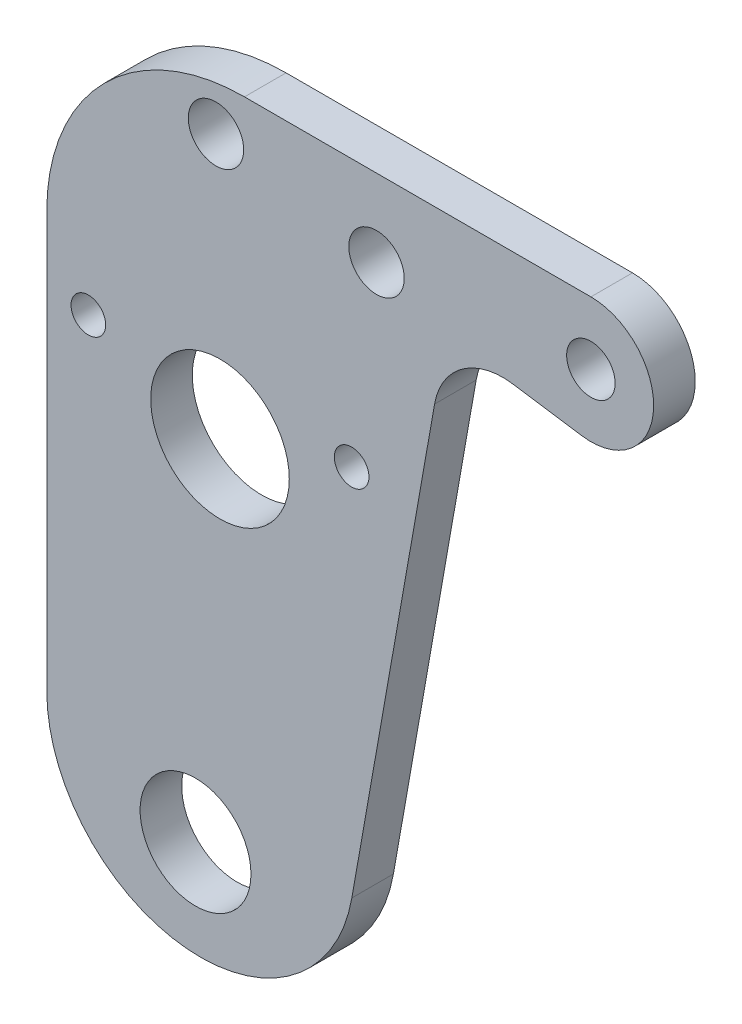
ISO-10303-21;
HEADER;
FILE_DESCRIPTION(('STEP AP214'),'2;1');
FILE_NAME('part.step','',(''),(''),'','','');
FILE_SCHEMA(('AUTOMOTIVE_DESIGN { 1 0 10303 214 1 1 1 1 }'));
ENDSEC;
DATA;
#1=APPLICATION_CONTEXT('core data for automotive mechanical design processes');
#2=APPLICATION_PROTOCOL_DEFINITION('international standard','automotive_design',2000,#1);
#3=PRODUCT_CONTEXT('',#1,'mechanical');
#4=PRODUCT('Part','Part','',(#3));
#5=PRODUCT_RELATED_PRODUCT_CATEGORY('part','',(#4));
#6=PRODUCT_DEFINITION_FORMATION('','',#4);
#7=PRODUCT_DEFINITION_CONTEXT('part definition',#1,'design');
#8=PRODUCT_DEFINITION('design','',#6,#7);
#9=PRODUCT_DEFINITION_SHAPE('','',#8);
#10=(LENGTH_UNIT() NAMED_UNIT(*) SI_UNIT(.MILLI.,.METRE.));
#11=(NAMED_UNIT(*) PLANE_ANGLE_UNIT() SI_UNIT($,.RADIAN.));
#12=(NAMED_UNIT(*) SI_UNIT($,.STERADIAN.) SOLID_ANGLE_UNIT());
#13=UNCERTAINTY_MEASURE_WITH_UNIT(LENGTH_MEASURE(1.E-05),#10,'distance_accuracy_value','');
#14=(GEOMETRIC_REPRESENTATION_CONTEXT(3) GLOBAL_UNCERTAINTY_ASSIGNED_CONTEXT((#13)) GLOBAL_UNIT_ASSIGNED_CONTEXT((#10,
#11,#12)) REPRESENTATION_CONTEXT('',''));
#15=CARTESIAN_POINT('',(0.,0.,0.));
#16=DIRECTION('',(0.,0.,1.));
#17=DIRECTION('',(1.,0.,0.));
#18=AXIS2_PLACEMENT_3D('',#15,#16,#17);
#19=CARTESIAN_POINT('',(-1.40800828095821,-15.,3.));
#20=DIRECTION('',(0.,0.,1.));
#21=DIRECTION('',(1.,0.,0.));
#22=AXIS2_PLACEMENT_3D('',#19,#20,#21);
#23=PLANE('',#22);
#24=CARTESIAN_POINT('',(11.2954093650333,23.6808514268258,3.));
#25=DIRECTION('',(0.,0.,1.));
#26=DIRECTION('',(1.,0.,0.));
#27=AXIS2_PLACEMENT_3D('',#24,#25,#26);
#28=CIRCLE('',#27,2.);
#29=CARTESIAN_POINT('',(13.2954093650333,23.6808514268258,3.));
#30=VERTEX_POINT('',#29);
#31=EDGE_CURVE('E219',#30,#30,#28,.T.);
#32=ORIENTED_EDGE('',*,*,#31,.F.);
#33=EDGE_LOOP('',(#32));
#34=FACE_BOUND('',#33,.T.);
#35=CARTESIAN_POINT('',(-0.289384277536325,25.9197319062456,3.));
#36=DIRECTION('',(0.,0.,1.));
#37=DIRECTION('',(1.,0.,0.));
#38=AXIS2_PLACEMENT_3D('',#35,#36,#37);
#39=CIRCLE('',#38,2.);
#40=CARTESIAN_POINT('',(1.71061572246368,25.9197319062456,3.));
#41=VERTEX_POINT('',#40);
#42=EDGE_CURVE('E216',#41,#41,#39,.T.);
#43=ORIENTED_EDGE('',*,*,#42,.F.);
#44=EDGE_LOOP('',(#43));
#45=FACE_BOUND('',#44,.T.);
#46=CARTESIAN_POINT('',(26.7667788981174,24.7387140079105,3.));
#47=DIRECTION('',(0.,0.,1.));
#48=DIRECTION('',(1.,0.,0.));
#49=AXIS2_PLACEMENT_3D('',#46,#47,#48);
#50=CIRCLE('',#49,1.75);
#51=CARTESIAN_POINT('',(28.5167788981174,24.7387140079105,3.));
#52=VERTEX_POINT('',#51);
#53=EDGE_CURVE('E207',#52,#52,#50,.T.);
#54=ORIENTED_EDGE('',*,*,#53,.F.);
#55=EDGE_LOOP('',(#54));
#56=FACE_BOUND('',#55,.T.);
#57=CARTESIAN_POINT('',(-9.5,10.,3.));
#58=DIRECTION('',(0.,0.,1.));
#59=DIRECTION('',(1.,0.,0.));
#60=AXIS2_PLACEMENT_3D('',#57,#58,#59);
#61=CIRCLE('',#60,1.25);
#62=CARTESIAN_POINT('',(-8.25,10.,3.));
#63=VERTEX_POINT('',#62);
#64=EDGE_CURVE('E202',#63,#63,#61,.T.);
#65=ORIENTED_EDGE('',*,*,#64,.F.);
#66=EDGE_LOOP('',(#65));
#67=FACE_BOUND('',#66,.T.);
#68=CARTESIAN_POINT('',(9.5,10.,3.));
#69=DIRECTION('',(0.,0.,1.));
#70=DIRECTION('',(1.,0.,0.));
#71=AXIS2_PLACEMENT_3D('',#68,#69,#70);
#72=CIRCLE('',#71,1.25);
#73=CARTESIAN_POINT('',(10.75,10.,3.));
#74=VERTEX_POINT('',#73);
#75=EDGE_CURVE('E199',#74,#74,#72,.T.);
#76=ORIENTED_EDGE('',*,*,#75,.F.);
#77=EDGE_LOOP('',(#76));
#78=FACE_BOUND('',#77,.T.);
#79=CARTESIAN_POINT('',(0.,7.,3.));
#80=DIRECTION('',(0.,0.,1.));
#81=DIRECTION('',(1.,0.,0.));
#82=AXIS2_PLACEMENT_3D('',#79,#80,#81);
#83=CIRCLE('',#82,5.);
#84=CARTESIAN_POINT('',(5.,7.,3.));
#85=VERTEX_POINT('',#84);
#86=EDGE_CURVE('E192',#85,#85,#83,.T.);
#87=ORIENTED_EDGE('',*,*,#86,.F.);
#88=EDGE_LOOP('',(#87));
#89=FACE_BOUND('',#88,.T.);
#90=CARTESIAN_POINT('',(-1.40800828095821,-15.,3.));
#91=DIRECTION('',(0.,0.,1.));
#92=DIRECTION('',(1.,0.,0.));
#93=AXIS2_PLACEMENT_3D('',#90,#91,#92);
#94=CIRCLE('',#93,11.0919917190418);
#95=CARTESIAN_POINT('',(-12.5,-15.,3.));
#96=VERTEX_POINT('',#95);
#97=CARTESIAN_POINT('',(9.51547116030137,-16.9261041487082,3.));
#98=VERTEX_POINT('',#97);
#99=EDGE_CURVE('E149',#96,#98,#94,.T.);
#100=ORIENTED_EDGE('',*,*,#99,.T.);
#101=DIRECTION('',(0.173648177666924,0.984807753012209,0.));
#102=VECTOR('',#101,1.);
#103=CARTESIAN_POINT('',(15.4845288396986,16.9261041487082,3.));
#104=LINE('',#103,#102);
#105=CARTESIAN_POINT('',(15.4845288396986,16.9261041487082,3.));
#106=VERTEX_POINT('',#105);
#107=EDGE_CURVE('E97',#98,#106,#104,.T.);
#108=ORIENTED_EDGE('',*,*,#107,.T.);
#109=CARTESIAN_POINT('',(20.4085676047597,16.0578632603736,3.));
#110=DIRECTION('',(0.,0.,-1.));
#111=DIRECTION('',(1.,0.,0.));
#112=AXIS2_PLACEMENT_3D('',#109,#110,#111);
#113=CIRCLE('',#112,5.);
#114=CARTESIAN_POINT('',(21.1503450956942,21.0025337401875,3.));
#115=VERTEX_POINT('',#114);
#116=EDGE_CURVE('E164',#106,#115,#113,.T.);
#117=ORIENTED_EDGE('',*,*,#116,.T.);
#118=DIRECTION('',(0.988934095962776,-0.148355498186913,0.));
#119=VECTOR('',#118,1.);
#120=CARTESIAN_POINT('',(26.0950155755081,20.2607562492529,3.));
#121=LINE('',#120,#119);
#122=CARTESIAN_POINT('',(26.0950155755081,20.2607562492529,3.));
#123=VERTEX_POINT('',#122);
#124=EDGE_CURVE('E177',#115,#123,#121,.T.);
#125=ORIENTED_EDGE('',*,*,#124,.T.);
#126=CARTESIAN_POINT('',(26.7667788981174,24.7387140079105,3.));
#127=DIRECTION('',(0.,0.,1.));
#128=DIRECTION('',(-1.,0.,0.));
#129=AXIS2_PLACEMENT_3D('',#126,#127,#128);
#130=CIRCLE('',#129,4.52806489020693);
#131=CARTESIAN_POINT('',(26.7667788981174,29.2667788981174,3.));
#132=VERTEX_POINT('',#131);
#133=EDGE_CURVE('E116',#123,#132,#130,.T.);
#134=ORIENTED_EDGE('',*,*,#133,.T.);
#135=DIRECTION('',(-1.,0.,0.));
#136=VECTOR('',#135,1.);
#137=CARTESIAN_POINT('',(1.76677889811743,29.2667788981174,3.));
#138=LINE('',#137,#136);
#139=CARTESIAN_POINT('',(1.76677889811743,29.2667788981174,3.));
#140=VERTEX_POINT('',#139);
#141=EDGE_CURVE('E110',#132,#140,#138,.T.);
#142=ORIENTED_EDGE('',*,*,#141,.T.);
#143=CARTESIAN_POINT('',(1.76677889811743,15.,3.));
#144=DIRECTION('',(0.,0.,1.));
#145=DIRECTION('',(-1.,0.,0.));
#146=AXIS2_PLACEMENT_3D('',#143,#144,#145);
#147=CIRCLE('',#146,14.2667788981174);
#148=CARTESIAN_POINT('',(-12.5,15.,3.));
#149=VERTEX_POINT('',#148);
#150=EDGE_CURVE('E114',#140,#149,#147,.T.);
#151=ORIENTED_EDGE('',*,*,#150,.T.);
#152=DIRECTION('',(0.,-1.,0.));
#153=VECTOR('',#152,1.);
#154=CARTESIAN_POINT('',(-12.5,-15.,3.));
#155=LINE('',#154,#153);
#156=EDGE_CURVE('E54',#149,#96,#155,.T.);
#157=ORIENTED_EDGE('',*,*,#156,.T.);
#158=EDGE_LOOP('',(#100,#108,#117,#125,#134,#142,#151,#157));
#159=FACE_BOUND('',#158,.T.);
#160=CARTESIAN_POINT('',(-1.76464885854855,-19.0764204551448,3.));
#161=DIRECTION('',(0.,0.,1.));
#162=DIRECTION('',(1.,0.,0.));
#163=AXIS2_PLACEMENT_3D('',#160,#161,#162);
#164=CIRCLE('',#163,4.);
#165=CARTESIAN_POINT('',(2.23535114145145,-19.0764204551448,3.));
#166=VERTEX_POINT('',#165);
#167=EDGE_CURVE('E138',#166,#166,#164,.T.);
#168=ORIENTED_EDGE('',*,*,#167,.F.);
#169=EDGE_LOOP('',(#168));
#170=FACE_BOUND('',#169,.T.);
#171=ADVANCED_FACE('F37',(#34,#45,#56,#67,#78,#89,#159,#170),#23,.T.);
#172=CARTESIAN_POINT('',(-1.40800828095821,-15.,0.));
#173=DIRECTION('',(0.,0.,1.));
#174=DIRECTION('',(1.,0.,0.));
#175=AXIS2_PLACEMENT_3D('',#172,#173,#174);
#176=PLANE('',#175);
#177=CARTESIAN_POINT('',(11.2954093650333,23.6808514268258,0.));
#178=DIRECTION('',(0.,0.,1.));
#179=DIRECTION('',(1.,0.,0.));
#180=AXIS2_PLACEMENT_3D('',#177,#178,#179);
#181=CIRCLE('',#180,2.);
#182=CARTESIAN_POINT('',(13.2954093650333,23.6808514268258,0.));
#183=VERTEX_POINT('',#182);
#184=EDGE_CURVE('E210',#183,#183,#181,.T.);
#185=ORIENTED_EDGE('',*,*,#184,.T.);
#186=EDGE_LOOP('',(#185));
#187=FACE_BOUND('',#186,.T.);
#188=CARTESIAN_POINT('',(-0.289384277536325,25.9197319062456,0.));
#189=DIRECTION('',(0.,0.,1.));
#190=DIRECTION('',(1.,0.,0.));
#191=AXIS2_PLACEMENT_3D('',#188,#189,#190);
#192=CIRCLE('',#191,2.);
#193=CARTESIAN_POINT('',(1.71061572246368,25.9197319062456,0.));
#194=VERTEX_POINT('',#193);
#195=EDGE_CURVE('E213',#194,#194,#192,.T.);
#196=ORIENTED_EDGE('',*,*,#195,.T.);
#197=EDGE_LOOP('',(#196));
#198=FACE_BOUND('',#197,.T.);
#199=CARTESIAN_POINT('',(26.7667788981174,24.7387140079105,0.));
#200=DIRECTION('',(0.,0.,1.));
#201=DIRECTION('',(1.,0.,0.));
#202=AXIS2_PLACEMENT_3D('',#199,#200,#201);
#203=CIRCLE('',#202,1.75);
#204=CARTESIAN_POINT('',(28.5167788981174,24.7387140079105,0.));
#205=VERTEX_POINT('',#204);
#206=EDGE_CURVE('E193',#205,#205,#203,.T.);
#207=ORIENTED_EDGE('',*,*,#206,.T.);
#208=EDGE_LOOP('',(#207));
#209=FACE_BOUND('',#208,.T.);
#210=CARTESIAN_POINT('',(-9.5,10.,0.));
#211=DIRECTION('',(0.,0.,1.));
#212=DIRECTION('',(1.,0.,0.));
#213=AXIS2_PLACEMENT_3D('',#210,#211,#212);
#214=CIRCLE('',#213,1.25);
#215=CARTESIAN_POINT('',(-8.25,10.,0.));
#216=VERTEX_POINT('',#215);
#217=EDGE_CURVE('E186',#216,#216,#214,.T.);
#218=ORIENTED_EDGE('',*,*,#217,.T.);
#219=EDGE_LOOP('',(#218));
#220=FACE_BOUND('',#219,.T.);
#221=CARTESIAN_POINT('',(9.5,10.,0.));
#222=DIRECTION('',(0.,0.,1.));
#223=DIRECTION('',(1.,0.,0.));
#224=AXIS2_PLACEMENT_3D('',#221,#222,#223);
#225=CIRCLE('',#224,1.25);
#226=CARTESIAN_POINT('',(10.75,10.,0.));
#227=VERTEX_POINT('',#226);
#228=EDGE_CURVE('E196',#227,#227,#225,.T.);
#229=ORIENTED_EDGE('',*,*,#228,.T.);
#230=EDGE_LOOP('',(#229));
#231=FACE_BOUND('',#230,.T.);
#232=CARTESIAN_POINT('',(0.,7.,0.));
#233=DIRECTION('',(0.,0.,1.));
#234=DIRECTION('',(1.,0.,0.));
#235=AXIS2_PLACEMENT_3D('',#232,#233,#234);
#236=CIRCLE('',#235,5.);
#237=CARTESIAN_POINT('',(5.,7.,0.));
#238=VERTEX_POINT('',#237);
#239=EDGE_CURVE('E189',#238,#238,#236,.T.);
#240=ORIENTED_EDGE('',*,*,#239,.T.);
#241=EDGE_LOOP('',(#240));
#242=FACE_BOUND('',#241,.T.);
#243=CARTESIAN_POINT('',(-1.40800828095821,-15.,0.));
#244=DIRECTION('',(0.,0.,1.));
#245=DIRECTION('',(1.,0.,0.));
#246=AXIS2_PLACEMENT_3D('',#243,#244,#245);
#247=CIRCLE('',#246,11.0919917190418);
#248=CARTESIAN_POINT('',(-12.5,-15.,0.));
#249=VERTEX_POINT('',#248);
#250=CARTESIAN_POINT('',(9.51547116030137,-16.9261041487082,0.));
#251=VERTEX_POINT('',#250);
#252=EDGE_CURVE('E134',#249,#251,#247,.T.);
#253=ORIENTED_EDGE('',*,*,#252,.F.);
#254=DIRECTION('',(0.,-1.,0.));
#255=VECTOR('',#254,1.);
#256=CARTESIAN_POINT('',(-12.5,-15.,0.));
#257=LINE('',#256,#255);
#258=CARTESIAN_POINT('',(-12.5,15.,0.));
#259=VERTEX_POINT('',#258);
#260=EDGE_CURVE('E89',#259,#249,#257,.T.);
#261=ORIENTED_EDGE('',*,*,#260,.F.);
#262=CARTESIAN_POINT('',(1.76677889811743,15.,0.));
#263=DIRECTION('',(0.,0.,1.));
#264=DIRECTION('',(-1.,0.,0.));
#265=AXIS2_PLACEMENT_3D('',#262,#263,#264);
#266=CIRCLE('',#265,14.2667788981174);
#267=CARTESIAN_POINT('',(1.76677889811743,29.2667788981174,0.));
#268=VERTEX_POINT('',#267);
#269=EDGE_CURVE('E83',#268,#259,#266,.T.);
#270=ORIENTED_EDGE('',*,*,#269,.F.);
#271=DIRECTION('',(-1.,0.,0.));
#272=VECTOR('',#271,1.);
#273=CARTESIAN_POINT('',(1.76677889811743,29.2667788981174,0.));
#274=LINE('',#273,#272);
#275=CARTESIAN_POINT('',(26.7667788981174,29.2667788981174,0.));
#276=VERTEX_POINT('',#275);
#277=EDGE_CURVE('E124',#276,#268,#274,.T.);
#278=ORIENTED_EDGE('',*,*,#277,.F.);
#279=CARTESIAN_POINT('',(26.7667788981174,24.7387140079105,0.));
#280=DIRECTION('',(0.,0.,1.));
#281=DIRECTION('',(-1.,0.,0.));
#282=AXIS2_PLACEMENT_3D('',#279,#280,#281);
#283=CIRCLE('',#282,4.52806489020693);
#284=CARTESIAN_POINT('',(26.0950155755081,20.2607562492529,0.));
#285=VERTEX_POINT('',#284);
#286=EDGE_CURVE('E144',#285,#276,#283,.T.);
#287=ORIENTED_EDGE('',*,*,#286,.F.);
#288=DIRECTION('',(0.988934095962776,-0.148355498186913,0.));
#289=VECTOR('',#288,1.);
#290=CARTESIAN_POINT('',(26.0950155755081,20.2607562492529,0.));
#291=LINE('',#290,#289);
#292=CARTESIAN_POINT('',(21.1503450956942,21.0025337401875,0.));
#293=VERTEX_POINT('',#292);
#294=EDGE_CURVE('E142',#293,#285,#291,.T.);
#295=ORIENTED_EDGE('',*,*,#294,.F.);
#296=CARTESIAN_POINT('',(20.4085676047597,16.0578632603736,0.));
#297=DIRECTION('',(0.,0.,-1.));
#298=DIRECTION('',(1.,0.,0.));
#299=AXIS2_PLACEMENT_3D('',#296,#297,#298);
#300=CIRCLE('',#299,5.);
#301=CARTESIAN_POINT('',(15.4845288396986,16.9261041487082,0.));
#302=VERTEX_POINT('',#301);
#303=EDGE_CURVE('E140',#302,#293,#300,.T.);
#304=ORIENTED_EDGE('',*,*,#303,.F.);
#305=DIRECTION('',(0.173648177666924,0.984807753012209,0.));
#306=VECTOR('',#305,1.);
#307=CARTESIAN_POINT('',(15.4845288396986,16.9261041487082,0.));
#308=LINE('',#307,#306);
#309=EDGE_CURVE('E137',#251,#302,#308,.T.);
#310=ORIENTED_EDGE('',*,*,#309,.F.);
#311=EDGE_LOOP('',(#253,#261,#270,#278,#287,#295,#304,#310));
#312=FACE_BOUND('',#311,.T.);
#313=CARTESIAN_POINT('',(-1.76464885854855,-19.0764204551448,0.));
#314=DIRECTION('',(0.,0.,1.));
#315=DIRECTION('',(1.,0.,0.));
#316=AXIS2_PLACEMENT_3D('',#313,#314,#315);
#317=CIRCLE('',#316,4.);
#318=CARTESIAN_POINT('',(2.23535114145145,-19.0764204551448,0.));
#319=VERTEX_POINT('',#318);
#320=EDGE_CURVE('E183',#319,#319,#317,.T.);
#321=ORIENTED_EDGE('',*,*,#320,.T.);
#322=EDGE_LOOP('',(#321));
#323=FACE_BOUND('',#322,.T.);
#324=ADVANCED_FACE('F168',(#187,#198,#209,#220,#231,#242,#312,#323),#176,.F.);
#325=CARTESIAN_POINT('',(-1.40800828095821,-15.,3.));
#326=DIRECTION('',(0.,0.,-1.));
#327=DIRECTION('',(-1.,0.,0.));
#328=AXIS2_PLACEMENT_3D('',#325,#326,#327);
#329=CYLINDRICAL_SURFACE('',#328,11.0919917190418);
#330=ORIENTED_EDGE('',*,*,#252,.T.);
#331=DIRECTION('',(0.,0.,-1.));
#332=VECTOR('',#331,1.);
#333=CARTESIAN_POINT('',(9.51547116030137,-16.9261041487082,3.));
#334=LINE('',#333,#332);
#335=EDGE_CURVE('E11',#98,#251,#334,.T.);
#336=ORIENTED_EDGE('',*,*,#335,.F.);
#337=ORIENTED_EDGE('',*,*,#99,.F.);
#338=DIRECTION('',(0.,0.,-1.));
#339=VECTOR('',#338,1.);
#340=CARTESIAN_POINT('',(-12.5,-15.,3.));
#341=LINE('',#340,#339);
#342=EDGE_CURVE('E130',#96,#249,#341,.T.);
#343=ORIENTED_EDGE('',*,*,#342,.T.);
#344=EDGE_LOOP('',(#330,#336,#337,#343));
#345=FACE_BOUND('',#344,.T.);
#346=ADVANCED_FACE('F39',(#345),#329,.T.);
#347=CARTESIAN_POINT('',(15.4845288396986,16.9261041487082,3.));
#348=DIRECTION('',(-0.984807753012209,0.173648177666924,0.));
#349=DIRECTION('',(-0.173648177666924,-0.984807753012209,0.));
#350=AXIS2_PLACEMENT_3D('',#347,#348,#349);
#351=PLANE('',#350);
#352=ORIENTED_EDGE('',*,*,#309,.T.);
#353=DIRECTION('',(0.,0.,-1.));
#354=VECTOR('',#353,1.);
#355=CARTESIAN_POINT('',(15.4845288396986,16.9261041487082,3.));
#356=LINE('',#355,#354);
#357=EDGE_CURVE('E46',#106,#302,#356,.T.);
#358=ORIENTED_EDGE('',*,*,#357,.F.);
#359=ORIENTED_EDGE('',*,*,#107,.F.);
#360=ORIENTED_EDGE('',*,*,#335,.T.);
#361=EDGE_LOOP('',(#352,#358,#359,#360));
#362=FACE_BOUND('',#361,.T.);
#363=ADVANCED_FACE('F279',(#362),#351,.F.);
#364=CARTESIAN_POINT('',(20.4085676047597,16.0578632603736,3.));
#365=DIRECTION('',(0.,0.,-1.));
#366=DIRECTION('',(-1.,0.,0.));
#367=AXIS2_PLACEMENT_3D('',#364,#365,#366);
#368=CYLINDRICAL_SURFACE('',#367,5.);
#369=ORIENTED_EDGE('',*,*,#303,.T.);
#370=DIRECTION('',(0.,0.,-1.));
#371=VECTOR('',#370,1.);
#372=CARTESIAN_POINT('',(21.1503450956942,21.0025337401875,3.));
#373=LINE('',#372,#371);
#374=EDGE_CURVE('E156',#115,#293,#373,.T.);
#375=ORIENTED_EDGE('',*,*,#374,.F.);
#376=ORIENTED_EDGE('',*,*,#116,.F.);
#377=ORIENTED_EDGE('',*,*,#357,.T.);
#378=EDGE_LOOP('',(#369,#375,#376,#377));
#379=FACE_BOUND('',#378,.T.);
#380=ADVANCED_FACE('F162',(#379),#368,.F.);
#381=CARTESIAN_POINT('',(26.0950155755081,20.2607562492529,3.));
#382=DIRECTION('',(0.148355498186913,0.988934095962776,0.));
#383=DIRECTION('',(-0.988934095962776,0.148355498186913,0.));
#384=AXIS2_PLACEMENT_3D('',#381,#382,#383);
#385=PLANE('',#384);
#386=ORIENTED_EDGE('',*,*,#294,.T.);
#387=DIRECTION('',(0.,0.,-1.));
#388=VECTOR('',#387,1.);
#389=CARTESIAN_POINT('',(26.0950155755081,20.2607562492529,3.));
#390=LINE('',#389,#388);
#391=EDGE_CURVE('E153',#123,#285,#390,.T.);
#392=ORIENTED_EDGE('',*,*,#391,.F.);
#393=ORIENTED_EDGE('',*,*,#124,.F.);
#394=ORIENTED_EDGE('',*,*,#374,.T.);
#395=EDGE_LOOP('',(#386,#392,#393,#394));
#396=FACE_BOUND('',#395,.T.);
#397=ADVANCED_FACE('F173',(#396),#385,.F.);
#398=CARTESIAN_POINT('',(26.7667788981174,24.7387140079105,3.));
#399=DIRECTION('',(0.,0.,-1.));
#400=DIRECTION('',(-1.,0.,0.));
#401=AXIS2_PLACEMENT_3D('',#398,#399,#400);
#402=CYLINDRICAL_SURFACE('',#401,4.52806489020693);
#403=ORIENTED_EDGE('',*,*,#286,.T.);
#404=DIRECTION('',(0.,0.,-1.));
#405=VECTOR('',#404,1.);
#406=CARTESIAN_POINT('',(26.7667788981174,29.2667788981174,3.));
#407=LINE('',#406,#405);
#408=EDGE_CURVE('E125',#132,#276,#407,.T.);
#409=ORIENTED_EDGE('',*,*,#408,.F.);
#410=ORIENTED_EDGE('',*,*,#133,.F.);
#411=ORIENTED_EDGE('',*,*,#391,.T.);
#412=EDGE_LOOP('',(#403,#409,#410,#411));
#413=FACE_BOUND('',#412,.T.);
#414=ADVANCED_FACE('F176',(#413),#402,.T.);
#415=CARTESIAN_POINT('',(1.76677889811743,29.2667788981174,3.));
#416=DIRECTION('',(0.,-1.,0.));
#417=DIRECTION('',(0.,0.,-1.));
#418=AXIS2_PLACEMENT_3D('',#415,#416,#417);
#419=PLANE('',#418);
#420=ORIENTED_EDGE('',*,*,#277,.T.);
#421=DIRECTION('',(0.,0.,-1.));
#422=VECTOR('',#421,1.);
#423=CARTESIAN_POINT('',(1.76677889811743,29.2667788981174,3.));
#424=LINE('',#423,#422);
#425=EDGE_CURVE('E121',#140,#268,#424,.T.);
#426=ORIENTED_EDGE('',*,*,#425,.F.);
#427=ORIENTED_EDGE('',*,*,#141,.F.);
#428=ORIENTED_EDGE('',*,*,#408,.T.);
#429=EDGE_LOOP('',(#420,#426,#427,#428));
#430=FACE_BOUND('',#429,.T.);
#431=ADVANCED_FACE('F122',(#430),#419,.F.);
#432=CARTESIAN_POINT('',(1.76677889811743,15.,3.));
#433=DIRECTION('',(0.,0.,-1.));
#434=DIRECTION('',(-1.,0.,0.));
#435=AXIS2_PLACEMENT_3D('',#432,#433,#434);
#436=CYLINDRICAL_SURFACE('',#435,14.2667788981174);
#437=ORIENTED_EDGE('',*,*,#269,.T.);
#438=DIRECTION('',(0.,0.,-1.));
#439=VECTOR('',#438,1.);
#440=CARTESIAN_POINT('',(-12.5,15.,3.));
#441=LINE('',#440,#439);
#442=EDGE_CURVE('E126',#149,#259,#441,.T.);
#443=ORIENTED_EDGE('',*,*,#442,.F.);
#444=ORIENTED_EDGE('',*,*,#150,.F.);
#445=ORIENTED_EDGE('',*,*,#425,.T.);
#446=EDGE_LOOP('',(#437,#443,#444,#445));
#447=FACE_BOUND('',#446,.T.);
#448=ADVANCED_FACE('F128',(#447),#436,.T.);
#449=CARTESIAN_POINT('',(-12.5,-15.,3.));
#450=DIRECTION('',(1.,0.,0.));
#451=DIRECTION('',(0.,1.,0.));
#452=AXIS2_PLACEMENT_3D('',#449,#450,#451);
#453=PLANE('',#452);
#454=ORIENTED_EDGE('',*,*,#260,.T.);
#455=ORIENTED_EDGE('',*,*,#342,.F.);
#456=ORIENTED_EDGE('',*,*,#156,.F.);
#457=ORIENTED_EDGE('',*,*,#442,.T.);
#458=EDGE_LOOP('',(#454,#455,#456,#457));
#459=FACE_BOUND('',#458,.T.);
#460=ADVANCED_FACE('F260',(#459),#453,.F.);
#461=CARTESIAN_POINT('',(-1.76464885854855,-19.0764204551448,3.));
#462=DIRECTION('',(0.,0.,-1.));
#463=DIRECTION('',(-1.,0.,0.));
#464=AXIS2_PLACEMENT_3D('',#461,#462,#463);
#465=CYLINDRICAL_SURFACE('',#464,4.);
#466=ORIENTED_EDGE('',*,*,#167,.T.);
#467=EDGE_LOOP('',(#466));
#468=FACE_BOUND('',#467,.T.);
#469=ORIENTED_EDGE('',*,*,#320,.F.);
#470=EDGE_LOOP('',(#469));
#471=FACE_BOUND('',#470,.T.);
#472=ADVANCED_FACE('F250',(#468,#471),#465,.F.);
#473=CARTESIAN_POINT('',(0.,7.,0.));
#474=DIRECTION('',(0.,0.,1.));
#475=DIRECTION('',(1.,0.,0.));
#476=AXIS2_PLACEMENT_3D('',#473,#474,#475);
#477=CYLINDRICAL_SURFACE('',#476,5.);
#478=ORIENTED_EDGE('',*,*,#239,.F.);
#479=EDGE_LOOP('',(#478));
#480=FACE_BOUND('',#479,.T.);
#481=ORIENTED_EDGE('',*,*,#86,.T.);
#482=EDGE_LOOP('',(#481));
#483=FACE_BOUND('',#482,.T.);
#484=ADVANCED_FACE('F247',(#480,#483),#477,.F.);
#485=CARTESIAN_POINT('',(9.5,10.,0.));
#486=DIRECTION('',(0.,0.,1.));
#487=DIRECTION('',(1.,0.,0.));
#488=AXIS2_PLACEMENT_3D('',#485,#486,#487);
#489=CYLINDRICAL_SURFACE('',#488,1.25);
#490=ORIENTED_EDGE('',*,*,#228,.F.);
#491=EDGE_LOOP('',(#490));
#492=FACE_BOUND('',#491,.T.);
#493=ORIENTED_EDGE('',*,*,#75,.T.);
#494=EDGE_LOOP('',(#493));
#495=FACE_BOUND('',#494,.T.);
#496=ADVANCED_FACE('F249',(#492,#495),#489,.F.);
#497=CARTESIAN_POINT('',(-9.5,10.,0.));
#498=DIRECTION('',(0.,0.,1.));
#499=DIRECTION('',(1.,0.,0.));
#500=AXIS2_PLACEMENT_3D('',#497,#498,#499);
#501=CYLINDRICAL_SURFACE('',#500,1.25);
#502=ORIENTED_EDGE('',*,*,#217,.F.);
#503=EDGE_LOOP('',(#502));
#504=FACE_BOUND('',#503,.T.);
#505=ORIENTED_EDGE('',*,*,#64,.T.);
#506=EDGE_LOOP('',(#505));
#507=FACE_BOUND('',#506,.T.);
#508=ADVANCED_FACE('F257',(#504,#507),#501,.F.);
#509=CARTESIAN_POINT('',(26.7667788981174,24.7387140079105,0.));
#510=DIRECTION('',(0.,0.,1.));
#511=DIRECTION('',(1.,0.,0.));
#512=AXIS2_PLACEMENT_3D('',#509,#510,#511);
#513=CYLINDRICAL_SURFACE('',#512,1.75);
#514=ORIENTED_EDGE('',*,*,#206,.F.);
#515=EDGE_LOOP('',(#514));
#516=FACE_BOUND('',#515,.T.);
#517=ORIENTED_EDGE('',*,*,#53,.T.);
#518=EDGE_LOOP('',(#517));
#519=FACE_BOUND('',#518,.T.);
#520=ADVANCED_FACE('F307',(#516,#519),#513,.F.);
#521=CARTESIAN_POINT('',(-0.289384277536325,25.9197319062456,0.));
#522=DIRECTION('',(0.,0.,1.));
#523=DIRECTION('',(1.,0.,0.));
#524=AXIS2_PLACEMENT_3D('',#521,#522,#523);
#525=CYLINDRICAL_SURFACE('',#524,2.);
#526=ORIENTED_EDGE('',*,*,#195,.F.);
#527=EDGE_LOOP('',(#526));
#528=FACE_BOUND('',#527,.T.);
#529=ORIENTED_EDGE('',*,*,#42,.T.);
#530=EDGE_LOOP('',(#529));
#531=FACE_BOUND('',#530,.T.);
#532=ADVANCED_FACE('F230',(#528,#531),#525,.F.);
#533=CARTESIAN_POINT('',(11.2954093650333,23.6808514268258,0.));
#534=DIRECTION('',(0.,0.,1.));
#535=DIRECTION('',(1.,0.,0.));
#536=AXIS2_PLACEMENT_3D('',#533,#534,#535);
#537=CYLINDRICAL_SURFACE('',#536,2.);
#538=ORIENTED_EDGE('',*,*,#184,.F.);
#539=EDGE_LOOP('',(#538));
#540=FACE_BOUND('',#539,.T.);
#541=ORIENTED_EDGE('',*,*,#31,.T.);
#542=EDGE_LOOP('',(#541));
#543=FACE_BOUND('',#542,.T.);
#544=ADVANCED_FACE('F227',(#540,#543),#537,.F.);
#545=CLOSED_SHELL('',(#171,#324,#346,#363,#380,#397,#414,#431,#448,#460,#472,#484,#496,#508,
#520,#532,#544));
#546=MANIFOLD_SOLID_BREP('B2',#545);
#547=ADVANCED_BREP_SHAPE_REPRESENTATION('',(#18,#546),#14);
#548=SHAPE_DEFINITION_REPRESENTATION(#9,#547);
ENDSEC;
END-ISO-10303-21;
